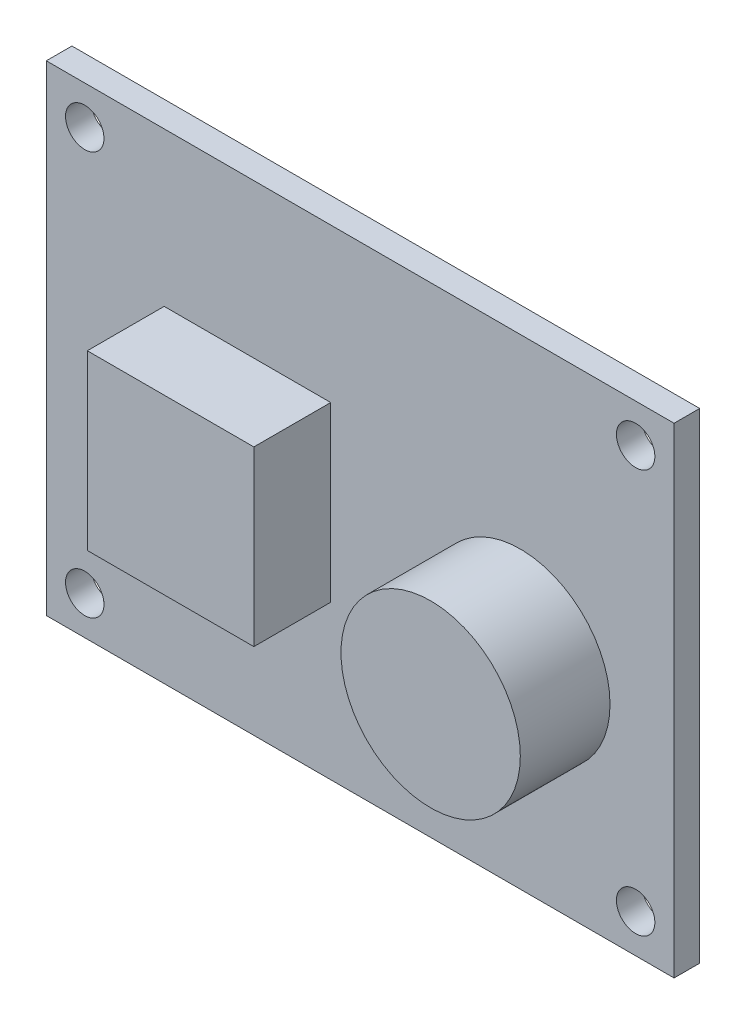
ISO-10303-21;
HEADER;
FILE_DESCRIPTION(('STEP AP214'),'2;1');
FILE_NAME('part.step','',(''),(''),'','','');
FILE_SCHEMA(('AUTOMOTIVE_DESIGN { 1 0 10303 214 1 1 1 1 }'));
ENDSEC;
DATA;
#1=APPLICATION_CONTEXT('core data for automotive mechanical design processes');
#2=APPLICATION_PROTOCOL_DEFINITION('international standard','automotive_design',2000,#1);
#3=PRODUCT_CONTEXT('',#1,'mechanical');
#4=PRODUCT('Part','Part','',(#3));
#5=PRODUCT_RELATED_PRODUCT_CATEGORY('part','',(#4));
#6=PRODUCT_DEFINITION_FORMATION('','',#4);
#7=PRODUCT_DEFINITION_CONTEXT('part definition',#1,'design');
#8=PRODUCT_DEFINITION('design','',#6,#7);
#9=PRODUCT_DEFINITION_SHAPE('','',#8);
#10=(LENGTH_UNIT() NAMED_UNIT(*) SI_UNIT(.MILLI.,.METRE.));
#11=(NAMED_UNIT(*) PLANE_ANGLE_UNIT() SI_UNIT($,.RADIAN.));
#12=(NAMED_UNIT(*) SI_UNIT($,.STERADIAN.) SOLID_ANGLE_UNIT());
#13=UNCERTAINTY_MEASURE_WITH_UNIT(LENGTH_MEASURE(1.E-05),#10,'distance_accuracy_value','');
#14=(GEOMETRIC_REPRESENTATION_CONTEXT(3) GLOBAL_UNCERTAINTY_ASSIGNED_CONTEXT((#13)) GLOBAL_UNIT_ASSIGNED_CONTEXT((#10,
#11,#12)) REPRESENTATION_CONTEXT('',''));
#15=CARTESIAN_POINT('',(0.,0.,0.));
#16=DIRECTION('',(0.,0.,1.));
#17=DIRECTION('',(1.,0.,0.));
#18=AXIS2_PLACEMENT_3D('',#15,#16,#17);
#19=CARTESIAN_POINT('',(0.,0.,2.));
#20=DIRECTION('',(0.,0.,1.));
#21=DIRECTION('',(1.,0.,0.));
#22=AXIS2_PLACEMENT_3D('',#19,#20,#21);
#23=PLANE('',#22);
#24=CARTESIAN_POINT('',(14.8889548356693,-5.44385176821636,2.));
#25=DIRECTION('',(0.,0.,1.));
#26=DIRECTION('',(1.,0.,0.));
#27=AXIS2_PLACEMENT_3D('',#24,#25,#26);
#28=CIRCLE('',#27,7.);
#29=CARTESIAN_POINT('',(21.8889548356693,-5.44385176821636,2.));
#30=VERTEX_POINT('',#29);
#31=EDGE_CURVE('E134',#30,#30,#28,.T.);
#32=ORIENTED_EDGE('',*,*,#31,.F.);
#33=EDGE_LOOP('',(#32));
#34=FACE_BOUND('',#33,.T.);
#35=CARTESIAN_POINT('',(-19.1110451643307,-18.4438517682164,2.));
#36=DIRECTION('',(0.,0.,1.));
#37=DIRECTION('',(1.,0.,0.));
#38=AXIS2_PLACEMENT_3D('',#35,#36,#37);
#39=CIRCLE('',#38,1.5);
#40=CARTESIAN_POINT('',(-17.6110451643307,-18.4438517682164,2.));
#41=VERTEX_POINT('',#40);
#42=EDGE_CURVE('E143',#41,#41,#39,.T.);
#43=ORIENTED_EDGE('',*,*,#42,.F.);
#44=EDGE_LOOP('',(#43));
#45=FACE_BOUND('',#44,.T.);
#46=CARTESIAN_POINT('',(23.8889548356693,-18.4438517682164,2.));
#47=DIRECTION('',(0.,0.,1.));
#48=DIRECTION('',(1.,0.,0.));
#49=AXIS2_PLACEMENT_3D('',#46,#47,#48);
#50=CIRCLE('',#49,1.5);
#51=CARTESIAN_POINT('',(25.3889548356693,-18.4438517682164,2.));
#52=VERTEX_POINT('',#51);
#53=EDGE_CURVE('E148',#52,#52,#50,.T.);
#54=ORIENTED_EDGE('',*,*,#53,.F.);
#55=EDGE_LOOP('',(#54));
#56=FACE_BOUND('',#55,.T.);
#57=CARTESIAN_POINT('',(23.8889548356693,13.0561482317836,2.));
#58=DIRECTION('',(0.,0.,1.));
#59=DIRECTION('',(1.,0.,0.));
#60=AXIS2_PLACEMENT_3D('',#57,#58,#59);
#61=CIRCLE('',#60,1.5);
#62=CARTESIAN_POINT('',(25.3889548356693,13.0561482317836,2.));
#63=VERTEX_POINT('',#62);
#64=EDGE_CURVE('E154',#63,#63,#61,.T.);
#65=ORIENTED_EDGE('',*,*,#64,.F.);
#66=EDGE_LOOP('',(#65));
#67=FACE_BOUND('',#66,.T.);
#68=CARTESIAN_POINT('',(-19.1110451643307,13.0561482317836,2.));
#69=DIRECTION('',(0.,0.,1.));
#70=DIRECTION('',(1.,0.,0.));
#71=AXIS2_PLACEMENT_3D('',#68,#69,#70);
#72=CIRCLE('',#71,1.5);
#73=CARTESIAN_POINT('',(-17.6110451643307,13.0561482317836,2.));
#74=VERTEX_POINT('',#73);
#75=EDGE_CURVE('E160',#74,#74,#72,.T.);
#76=ORIENTED_EDGE('',*,*,#75,.F.);
#77=EDGE_LOOP('',(#76));
#78=FACE_BOUND('',#77,.T.);
#79=DIRECTION('',(0.,-1.,0.));
#80=VECTOR('',#79,1.);
#81=CARTESIAN_POINT('',(-22.1110451643307,16.0561482317836,2.));
#82=LINE('',#81,#80);
#83=CARTESIAN_POINT('',(-22.1110451643307,16.0561482317836,2.));
#84=VERTEX_POINT('',#83);
#85=CARTESIAN_POINT('',(-22.1110451643307,-21.4438517682164,2.));
#86=VERTEX_POINT('',#85);
#87=EDGE_CURVE('E169',#84,#86,#82,.T.);
#88=ORIENTED_EDGE('',*,*,#87,.T.);
#89=DIRECTION('',(1.,0.,0.));
#90=VECTOR('',#89,1.);
#91=CARTESIAN_POINT('',(-22.1110451643307,-21.4438517682164,2.));
#92=LINE('',#91,#90);
#93=CARTESIAN_POINT('',(26.8889548356693,-21.4438517682164,2.));
#94=VERTEX_POINT('',#93);
#95=EDGE_CURVE('E87',#86,#94,#92,.T.);
#96=ORIENTED_EDGE('',*,*,#95,.T.);
#97=DIRECTION('',(0.,1.,0.));
#98=VECTOR('',#97,1.);
#99=CARTESIAN_POINT('',(26.8889548356693,16.0561482317836,2.));
#100=LINE('',#99,#98);
#101=CARTESIAN_POINT('',(26.8889548356693,16.0561482317836,2.));
#102=VERTEX_POINT('',#101);
#103=EDGE_CURVE('E172',#94,#102,#100,.T.);
#104=ORIENTED_EDGE('',*,*,#103,.T.);
#105=DIRECTION('',(-1.,0.,0.));
#106=VECTOR('',#105,1.);
#107=CARTESIAN_POINT('',(-22.1110451643307,16.0561482317836,2.));
#108=LINE('',#107,#106);
#109=EDGE_CURVE('E59',#102,#84,#108,.T.);
#110=ORIENTED_EDGE('',*,*,#109,.T.);
#111=EDGE_LOOP('',(#88,#96,#104,#110));
#112=FACE_BOUND('',#111,.T.);
#113=DIRECTION('',(1.,0.,0.));
#114=VECTOR('',#113,1.);
#115=CARTESIAN_POINT('',(-12.9110451643307,-9.44385176821636,2.));
#116=LINE('',#115,#114);
#117=CARTESIAN_POINT('',(-12.9110451643307,-9.44385176821636,2.));
#118=VERTEX_POINT('',#117);
#119=CARTESIAN_POINT('',(0.0889548356692616,-9.44385176821636,2.));
#120=VERTEX_POINT('',#119);
#121=EDGE_CURVE('E359',#118,#120,#116,.T.);
#122=ORIENTED_EDGE('',*,*,#121,.F.);
#123=DIRECTION('',(0.,-1.,0.));
#124=VECTOR('',#123,1.);
#125=CARTESIAN_POINT('',(-12.9110451643307,4.05614823178364,2.));
#126=LINE('',#125,#124);
#127=CARTESIAN_POINT('',(-12.9110451643307,4.05614823178364,2.));
#128=VERTEX_POINT('',#127);
#129=EDGE_CURVE('E132',#128,#118,#126,.T.);
#130=ORIENTED_EDGE('',*,*,#129,.F.);
#131=DIRECTION('',(-1.,0.,0.));
#132=VECTOR('',#131,1.);
#133=CARTESIAN_POINT('',(-12.9110451643307,4.05614823178364,2.));
#134=LINE('',#133,#132);
#135=CARTESIAN_POINT('',(0.0889548356692599,4.05614823178364,2.));
#136=VERTEX_POINT('',#135);
#137=EDGE_CURVE('E128',#136,#128,#134,.T.);
#138=ORIENTED_EDGE('',*,*,#137,.F.);
#139=DIRECTION('',(0.,1.,0.));
#140=VECTOR('',#139,1.);
#141=CARTESIAN_POINT('',(0.0889548356692599,4.05614823178364,2.));
#142=LINE('',#141,#140);
#143=EDGE_CURVE('E356',#120,#136,#142,.T.);
#144=ORIENTED_EDGE('',*,*,#143,.F.);
#145=EDGE_LOOP('',(#122,#130,#138,#144));
#146=FACE_BOUND('',#145,.T.);
#147=ADVANCED_FACE('F35',(#34,#45,#56,#67,#78,#112,#146),#23,.T.);
#148=CARTESIAN_POINT('',(-22.1110451643307,16.0561482317836,2.));
#149=DIRECTION('',(1.,0.,0.));
#150=DIRECTION('',(0.,1.,0.));
#151=AXIS2_PLACEMENT_3D('',#148,#149,#150);
#152=PLANE('',#151);
#153=DIRECTION('',(0.,-1.,0.));
#154=VECTOR('',#153,1.);
#155=CARTESIAN_POINT('',(-22.1110451643307,16.0561482317836,0.));
#156=LINE('',#155,#154);
#157=CARTESIAN_POINT('',(-22.1110451643307,16.0561482317836,0.));
#158=VERTEX_POINT('',#157);
#159=CARTESIAN_POINT('',(-22.1110451643307,-21.4438517682164,0.));
#160=VERTEX_POINT('',#159);
#161=EDGE_CURVE('E166',#158,#160,#156,.T.);
#162=ORIENTED_EDGE('',*,*,#161,.T.);
#163=DIRECTION('',(0.,0.,-1.));
#164=VECTOR('',#163,1.);
#165=CARTESIAN_POINT('',(-22.1110451643307,-21.4438517682164,2.));
#166=LINE('',#165,#164);
#167=EDGE_CURVE('E11',#86,#160,#166,.T.);
#168=ORIENTED_EDGE('',*,*,#167,.F.);
#169=ORIENTED_EDGE('',*,*,#87,.F.);
#170=DIRECTION('',(0.,0.,-1.));
#171=VECTOR('',#170,1.);
#172=CARTESIAN_POINT('',(-22.1110451643307,16.0561482317836,2.));
#173=LINE('',#172,#171);
#174=EDGE_CURVE('E175',#84,#158,#173,.T.);
#175=ORIENTED_EDGE('',*,*,#174,.T.);
#176=EDGE_LOOP('',(#162,#168,#169,#175));
#177=FACE_BOUND('',#176,.T.);
#178=ADVANCED_FACE('F37',(#177),#152,.F.);
#179=CARTESIAN_POINT('',(-22.1110451643307,-21.4438517682164,2.));
#180=DIRECTION('',(0.,1.,0.));
#181=DIRECTION('',(0.,0.,1.));
#182=AXIS2_PLACEMENT_3D('',#179,#180,#181);
#183=PLANE('',#182);
#184=DIRECTION('',(1.,0.,0.));
#185=VECTOR('',#184,1.);
#186=CARTESIAN_POINT('',(-22.1110451643307,-21.4438517682164,0.));
#187=LINE('',#186,#185);
#188=CARTESIAN_POINT('',(26.8889548356693,-21.4438517682164,0.));
#189=VERTEX_POINT('',#188);
#190=EDGE_CURVE('E178',#160,#189,#187,.T.);
#191=ORIENTED_EDGE('',*,*,#190,.T.);
#192=DIRECTION('',(0.,0.,-1.));
#193=VECTOR('',#192,1.);
#194=CARTESIAN_POINT('',(26.8889548356693,-21.4438517682164,2.));
#195=LINE('',#194,#193);
#196=EDGE_CURVE('E43',#94,#189,#195,.T.);
#197=ORIENTED_EDGE('',*,*,#196,.F.);
#198=ORIENTED_EDGE('',*,*,#95,.F.);
#199=ORIENTED_EDGE('',*,*,#167,.T.);
#200=EDGE_LOOP('',(#191,#197,#198,#199));
#201=FACE_BOUND('',#200,.T.);
#202=ADVANCED_FACE('F207',(#201),#183,.F.);
#203=CARTESIAN_POINT('',(26.8889548356693,16.0561482317836,2.));
#204=DIRECTION('',(-1.,0.,0.));
#205=DIRECTION('',(0.,-1.,0.));
#206=AXIS2_PLACEMENT_3D('',#203,#204,#205);
#207=PLANE('',#206);
#208=DIRECTION('',(0.,1.,0.));
#209=VECTOR('',#208,1.);
#210=CARTESIAN_POINT('',(26.8889548356693,16.0561482317836,0.));
#211=LINE('',#210,#209);
#212=CARTESIAN_POINT('',(26.8889548356693,16.0561482317836,0.));
#213=VERTEX_POINT('',#212);
#214=EDGE_CURVE('E180',#189,#213,#211,.T.);
#215=ORIENTED_EDGE('',*,*,#214,.T.);
#216=DIRECTION('',(0.,0.,-1.));
#217=VECTOR('',#216,1.);
#218=CARTESIAN_POINT('',(26.8889548356693,16.0561482317836,2.));
#219=LINE('',#218,#217);
#220=EDGE_CURVE('E184',#102,#213,#219,.T.);
#221=ORIENTED_EDGE('',*,*,#220,.F.);
#222=ORIENTED_EDGE('',*,*,#103,.F.);
#223=ORIENTED_EDGE('',*,*,#196,.T.);
#224=EDGE_LOOP('',(#215,#221,#222,#223));
#225=FACE_BOUND('',#224,.T.);
#226=ADVANCED_FACE('F189',(#225),#207,.F.);
#227=CARTESIAN_POINT('',(-22.1110451643307,16.0561482317836,2.));
#228=DIRECTION('',(0.,-1.,0.));
#229=DIRECTION('',(0.,0.,-1.));
#230=AXIS2_PLACEMENT_3D('',#227,#228,#229);
#231=PLANE('',#230);
#232=DIRECTION('',(-1.,0.,0.));
#233=VECTOR('',#232,1.);
#234=CARTESIAN_POINT('',(-22.1110451643307,16.0561482317836,0.));
#235=LINE('',#234,#233);
#236=EDGE_CURVE('E80',#213,#158,#235,.T.);
#237=ORIENTED_EDGE('',*,*,#236,.T.);
#238=ORIENTED_EDGE('',*,*,#174,.F.);
#239=ORIENTED_EDGE('',*,*,#109,.F.);
#240=ORIENTED_EDGE('',*,*,#220,.T.);
#241=EDGE_LOOP('',(#237,#238,#239,#240));
#242=FACE_BOUND('',#241,.T.);
#243=ADVANCED_FACE('F197',(#242),#231,.F.);
#244=CARTESIAN_POINT('',(0.,0.,0.));
#245=DIRECTION('',(0.,0.,1.));
#246=DIRECTION('',(1.,0.,0.));
#247=AXIS2_PLACEMENT_3D('',#244,#245,#246);
#248=PLANE('',#247);
#249=CARTESIAN_POINT('',(-19.1110451643307,-18.4438517682164,0.));
#250=DIRECTION('',(0.,0.,1.));
#251=DIRECTION('',(1.,0.,0.));
#252=AXIS2_PLACEMENT_3D('',#249,#250,#251);
#253=CIRCLE('',#252,1.5);
#254=CARTESIAN_POINT('',(-17.6110451643307,-18.4438517682164,0.));
#255=VERTEX_POINT('',#254);
#256=EDGE_CURVE('E145',#255,#255,#253,.T.);
#257=ORIENTED_EDGE('',*,*,#256,.T.);
#258=EDGE_LOOP('',(#257));
#259=FACE_BOUND('',#258,.T.);
#260=CARTESIAN_POINT('',(23.8889548356693,-18.4438517682164,0.));
#261=DIRECTION('',(0.,0.,1.));
#262=DIRECTION('',(1.,0.,0.));
#263=AXIS2_PLACEMENT_3D('',#260,#261,#262);
#264=CIRCLE('',#263,1.5);
#265=CARTESIAN_POINT('',(25.3889548356693,-18.4438517682164,0.));
#266=VERTEX_POINT('',#265);
#267=EDGE_CURVE('E151',#266,#266,#264,.T.);
#268=ORIENTED_EDGE('',*,*,#267,.T.);
#269=EDGE_LOOP('',(#268));
#270=FACE_BOUND('',#269,.T.);
#271=CARTESIAN_POINT('',(23.8889548356693,13.0561482317836,0.));
#272=DIRECTION('',(0.,0.,1.));
#273=DIRECTION('',(1.,0.,0.));
#274=AXIS2_PLACEMENT_3D('',#271,#272,#273);
#275=CIRCLE('',#274,1.5);
#276=CARTESIAN_POINT('',(25.3889548356693,13.0561482317836,0.));
#277=VERTEX_POINT('',#276);
#278=EDGE_CURVE('E157',#277,#277,#275,.T.);
#279=ORIENTED_EDGE('',*,*,#278,.T.);
#280=EDGE_LOOP('',(#279));
#281=FACE_BOUND('',#280,.T.);
#282=CARTESIAN_POINT('',(-19.1110451643307,13.0561482317836,0.));
#283=DIRECTION('',(0.,0.,1.));
#284=DIRECTION('',(1.,0.,0.));
#285=AXIS2_PLACEMENT_3D('',#282,#283,#284);
#286=CIRCLE('',#285,1.5);
#287=CARTESIAN_POINT('',(-17.6110451643307,13.0561482317836,0.));
#288=VERTEX_POINT('',#287);
#289=EDGE_CURVE('E163',#288,#288,#286,.T.);
#290=ORIENTED_EDGE('',*,*,#289,.T.);
#291=EDGE_LOOP('',(#290));
#292=FACE_BOUND('',#291,.T.);
#293=ORIENTED_EDGE('',*,*,#161,.F.);
#294=ORIENTED_EDGE('',*,*,#236,.F.);
#295=ORIENTED_EDGE('',*,*,#214,.F.);
#296=ORIENTED_EDGE('',*,*,#190,.F.);
#297=EDGE_LOOP('',(#293,#294,#295,#296));
#298=FACE_BOUND('',#297,.T.);
#299=ADVANCED_FACE('F193',(#259,#270,#281,#292,#298),#248,.F.);
#300=CARTESIAN_POINT('',(-19.1110451643307,13.0561482317836,0.));
#301=DIRECTION('',(0.,0.,1.));
#302=DIRECTION('',(1.,0.,0.));
#303=AXIS2_PLACEMENT_3D('',#300,#301,#302);
#304=CYLINDRICAL_SURFACE('',#303,1.5);
#305=ORIENTED_EDGE('',*,*,#289,.F.);
#306=EDGE_LOOP('',(#305));
#307=FACE_BOUND('',#306,.T.);
#308=ORIENTED_EDGE('',*,*,#75,.T.);
#309=EDGE_LOOP('',(#308));
#310=FACE_BOUND('',#309,.T.);
#311=ADVANCED_FACE('F204',(#307,#310),#304,.F.);
#312=CARTESIAN_POINT('',(23.8889548356693,13.0561482317836,0.));
#313=DIRECTION('',(0.,0.,1.));
#314=DIRECTION('',(1.,0.,0.));
#315=AXIS2_PLACEMENT_3D('',#312,#313,#314);
#316=CYLINDRICAL_SURFACE('',#315,1.5);
#317=ORIENTED_EDGE('',*,*,#278,.F.);
#318=EDGE_LOOP('',(#317));
#319=FACE_BOUND('',#318,.T.);
#320=ORIENTED_EDGE('',*,*,#64,.T.);
#321=EDGE_LOOP('',(#320));
#322=FACE_BOUND('',#321,.T.);
#323=ADVANCED_FACE('F220',(#319,#322),#316,.F.);
#324=CARTESIAN_POINT('',(23.8889548356693,-18.4438517682164,0.));
#325=DIRECTION('',(0.,0.,1.));
#326=DIRECTION('',(1.,0.,0.));
#327=AXIS2_PLACEMENT_3D('',#324,#325,#326);
#328=CYLINDRICAL_SURFACE('',#327,1.5);
#329=ORIENTED_EDGE('',*,*,#267,.F.);
#330=EDGE_LOOP('',(#329));
#331=FACE_BOUND('',#330,.T.);
#332=ORIENTED_EDGE('',*,*,#53,.T.);
#333=EDGE_LOOP('',(#332));
#334=FACE_BOUND('',#333,.T.);
#335=ADVANCED_FACE('F224',(#331,#334),#328,.F.);
#336=CARTESIAN_POINT('',(-19.1110451643307,-18.4438517682164,0.));
#337=DIRECTION('',(0.,0.,1.));
#338=DIRECTION('',(1.,0.,0.));
#339=AXIS2_PLACEMENT_3D('',#336,#337,#338);
#340=CYLINDRICAL_SURFACE('',#339,1.5);
#341=ORIENTED_EDGE('',*,*,#256,.F.);
#342=EDGE_LOOP('',(#341));
#343=FACE_BOUND('',#342,.T.);
#344=ORIENTED_EDGE('',*,*,#42,.T.);
#345=EDGE_LOOP('',(#344));
#346=FACE_BOUND('',#345,.T.);
#347=ADVANCED_FACE('F228',(#343,#346),#340,.F.);
#348=CARTESIAN_POINT('',(14.8889548356693,-5.44385176821636,9.));
#349=DIRECTION('',(0.,0.,-1.));
#350=DIRECTION('',(-1.,0.,0.));
#351=AXIS2_PLACEMENT_3D('',#348,#349,#350);
#352=CYLINDRICAL_SURFACE('',#351,7.);
#353=CARTESIAN_POINT('',(14.8889548356693,-5.44385176821636,9.));
#354=DIRECTION('',(0.,0.,1.));
#355=DIRECTION('',(1.,0.,0.));
#356=AXIS2_PLACEMENT_3D('',#353,#354,#355);
#357=CIRCLE('',#356,7.);
#358=CARTESIAN_POINT('',(21.8889548356693,-5.44385176821636,9.));
#359=VERTEX_POINT('',#358);
#360=EDGE_CURVE('E137',#359,#359,#357,.T.);
#361=ORIENTED_EDGE('',*,*,#360,.F.);
#362=EDGE_LOOP('',(#361));
#363=FACE_BOUND('',#362,.T.);
#364=ORIENTED_EDGE('',*,*,#31,.T.);
#365=EDGE_LOOP('',(#364));
#366=FACE_BOUND('',#365,.T.);
#367=ADVANCED_FACE('F232',(#363,#366),#352,.T.);
#368=CARTESIAN_POINT('',(14.8889548356693,-5.44385176821636,9.));
#369=DIRECTION('',(0.,0.,1.));
#370=DIRECTION('',(1.,0.,0.));
#371=AXIS2_PLACEMENT_3D('',#368,#369,#370);
#372=PLANE('',#371);
#373=ORIENTED_EDGE('',*,*,#360,.T.);
#374=EDGE_LOOP('',(#373));
#375=FACE_BOUND('',#374,.T.);
#376=ADVANCED_FACE('F236',(#375),#372,.T.);
#377=CARTESIAN_POINT('',(-12.9110451643307,4.05614823178364,8.));
#378=DIRECTION('',(1.,0.,0.));
#379=DIRECTION('',(0.,1.,0.));
#380=AXIS2_PLACEMENT_3D('',#377,#378,#379);
#381=PLANE('',#380);
#382=ORIENTED_EDGE('',*,*,#129,.T.);
#383=DIRECTION('',(0.,0.,-1.));
#384=VECTOR('',#383,1.);
#385=CARTESIAN_POINT('',(-12.9110451643307,-9.44385176821636,8.));
#386=LINE('',#385,#384);
#387=CARTESIAN_POINT('',(-12.9110451643307,-9.44385176821636,8.));
#388=VERTEX_POINT('',#387);
#389=EDGE_CURVE('E113',#388,#118,#386,.T.);
#390=ORIENTED_EDGE('',*,*,#389,.F.);
#391=DIRECTION('',(0.,-1.,0.));
#392=VECTOR('',#391,1.);
#393=CARTESIAN_POINT('',(-12.9110451643307,4.05614823178364,8.));
#394=LINE('',#393,#392);
#395=CARTESIAN_POINT('',(-12.9110451643307,4.05614823178364,8.));
#396=VERTEX_POINT('',#395);
#397=EDGE_CURVE('E120',#396,#388,#394,.T.);
#398=ORIENTED_EDGE('',*,*,#397,.F.);
#399=DIRECTION('',(0.,0.,-1.));
#400=VECTOR('',#399,1.);
#401=CARTESIAN_POINT('',(-12.9110451643307,4.05614823178364,8.));
#402=LINE('',#401,#400);
#403=EDGE_CURVE('E353',#396,#128,#402,.T.);
#404=ORIENTED_EDGE('',*,*,#403,.T.);
#405=EDGE_LOOP('',(#382,#390,#398,#404));
#406=FACE_BOUND('',#405,.T.);
#407=ADVANCED_FACE('F130',(#406),#381,.F.);
#408=CARTESIAN_POINT('',(-12.9110451643307,-9.44385176821636,8.));
#409=DIRECTION('',(0.,1.,0.));
#410=DIRECTION('',(0.,0.,1.));
#411=AXIS2_PLACEMENT_3D('',#408,#409,#410);
#412=PLANE('',#411);
#413=ORIENTED_EDGE('',*,*,#121,.T.);
#414=DIRECTION('',(0.,0.,-1.));
#415=VECTOR('',#414,1.);
#416=CARTESIAN_POINT('',(0.0889548356692616,-9.44385176821636,8.));
#417=LINE('',#416,#415);
#418=CARTESIAN_POINT('',(0.0889548356692616,-9.44385176821636,8.));
#419=VERTEX_POINT('',#418);
#420=EDGE_CURVE('E116',#419,#120,#417,.T.);
#421=ORIENTED_EDGE('',*,*,#420,.F.);
#422=DIRECTION('',(1.,0.,0.));
#423=VECTOR('',#422,1.);
#424=CARTESIAN_POINT('',(-12.9110451643307,-9.44385176821636,8.));
#425=LINE('',#424,#423);
#426=EDGE_CURVE('E109',#388,#419,#425,.T.);
#427=ORIENTED_EDGE('',*,*,#426,.F.);
#428=ORIENTED_EDGE('',*,*,#389,.T.);
#429=EDGE_LOOP('',(#413,#421,#427,#428));
#430=FACE_BOUND('',#429,.T.);
#431=ADVANCED_FACE('F111',(#430),#412,.F.);
#432=CARTESIAN_POINT('',(0.0889548356692599,4.05614823178364,8.));
#433=DIRECTION('',(-1.,0.,0.));
#434=DIRECTION('',(0.,-1.,0.));
#435=AXIS2_PLACEMENT_3D('',#432,#433,#434);
#436=PLANE('',#435);
#437=ORIENTED_EDGE('',*,*,#143,.T.);
#438=DIRECTION('',(0.,0.,-1.));
#439=VECTOR('',#438,1.);
#440=CARTESIAN_POINT('',(0.0889548356692599,4.05614823178364,8.));
#441=LINE('',#440,#439);
#442=CARTESIAN_POINT('',(0.0889548356692599,4.05614823178364,8.));
#443=VERTEX_POINT('',#442);
#444=EDGE_CURVE('E50',#443,#136,#441,.T.);
#445=ORIENTED_EDGE('',*,*,#444,.F.);
#446=DIRECTION('',(0.,1.,0.));
#447=VECTOR('',#446,1.);
#448=CARTESIAN_POINT('',(0.0889548356692599,4.05614823178364,8.));
#449=LINE('',#448,#447);
#450=EDGE_CURVE('E119',#419,#443,#449,.T.);
#451=ORIENTED_EDGE('',*,*,#450,.F.);
#452=ORIENTED_EDGE('',*,*,#420,.T.);
#453=EDGE_LOOP('',(#437,#445,#451,#452));
#454=FACE_BOUND('',#453,.T.);
#455=ADVANCED_FACE('F245',(#454),#436,.F.);
#456=CARTESIAN_POINT('',(-12.9110451643307,4.05614823178364,8.));
#457=DIRECTION('',(0.,-1.,0.));
#458=DIRECTION('',(0.,0.,-1.));
#459=AXIS2_PLACEMENT_3D('',#456,#457,#458);
#460=PLANE('',#459);
#461=ORIENTED_EDGE('',*,*,#137,.T.);
#462=ORIENTED_EDGE('',*,*,#403,.F.);
#463=DIRECTION('',(-1.,0.,0.));
#464=VECTOR('',#463,1.);
#465=CARTESIAN_POINT('',(-12.9110451643307,4.05614823178364,8.));
#466=LINE('',#465,#464);
#467=EDGE_CURVE('E124',#443,#396,#466,.T.);
#468=ORIENTED_EDGE('',*,*,#467,.F.);
#469=ORIENTED_EDGE('',*,*,#444,.T.);
#470=EDGE_LOOP('',(#461,#462,#468,#469));
#471=FACE_BOUND('',#470,.T.);
#472=ADVANCED_FACE('F248',(#471),#460,.F.);
#473=CARTESIAN_POINT('',(0.,0.,8.));
#474=DIRECTION('',(0.,0.,1.));
#475=DIRECTION('',(1.,0.,0.));
#476=AXIS2_PLACEMENT_3D('',#473,#474,#475);
#477=PLANE('',#476);
#478=ORIENTED_EDGE('',*,*,#397,.T.);
#479=ORIENTED_EDGE('',*,*,#426,.T.);
#480=ORIENTED_EDGE('',*,*,#450,.T.);
#481=ORIENTED_EDGE('',*,*,#467,.T.);
#482=EDGE_LOOP('',(#478,#479,#480,#481));
#483=FACE_BOUND('',#482,.T.);
#484=ADVANCED_FACE('F123',(#483),#477,.T.);
#485=CLOSED_SHELL('',(#147,#178,#202,#226,#243,#299,#311,#323,#335,#347,#367,#376,#407,#431,
#455,#472,#484));
#486=MANIFOLD_SOLID_BREP('B2',#485);
#487=ADVANCED_BREP_SHAPE_REPRESENTATION('',(#18,#486),#14);
#488=SHAPE_DEFINITION_REPRESENTATION(#9,#487);
ENDSEC;
END-ISO-10303-21;
